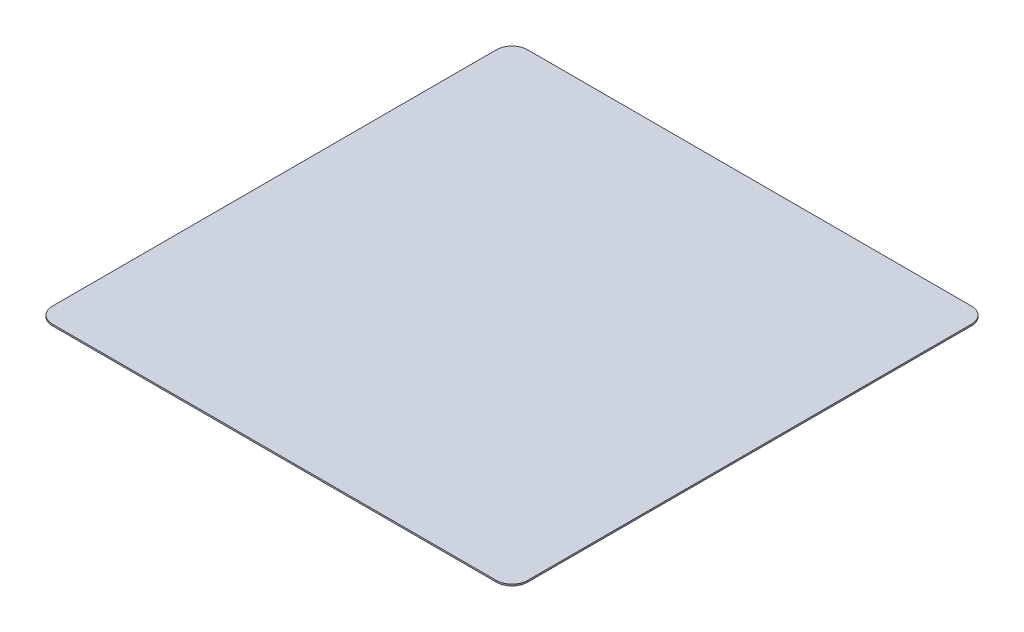
ISO-10303-21;
HEADER;
FILE_DESCRIPTION(('STEP AP214'),'2;1');
FILE_NAME('part.step','',(''),(''),'','','');
FILE_SCHEMA(('AUTOMOTIVE_DESIGN { 1 0 10303 214 1 1 1 1 }'));
ENDSEC;
DATA;
#1=APPLICATION_CONTEXT('core data for automotive mechanical design processes');
#2=APPLICATION_PROTOCOL_DEFINITION('international standard','automotive_design',2000,#1);
#3=PRODUCT_CONTEXT('',#1,'mechanical');
#4=PRODUCT('Part','Part','',(#3));
#5=PRODUCT_RELATED_PRODUCT_CATEGORY('part','',(#4));
#6=PRODUCT_DEFINITION_FORMATION('','',#4);
#7=PRODUCT_DEFINITION_CONTEXT('part definition',#1,'design');
#8=PRODUCT_DEFINITION('design','',#6,#7);
#9=PRODUCT_DEFINITION_SHAPE('','',#8);
#10=(LENGTH_UNIT() NAMED_UNIT(*) SI_UNIT(.MILLI.,.METRE.));
#11=(NAMED_UNIT(*) PLANE_ANGLE_UNIT() SI_UNIT($,.RADIAN.));
#12=(NAMED_UNIT(*) SI_UNIT($,.STERADIAN.) SOLID_ANGLE_UNIT());
#13=UNCERTAINTY_MEASURE_WITH_UNIT(LENGTH_MEASURE(1.E-05),#10,'distance_accuracy_value','');
#14=(GEOMETRIC_REPRESENTATION_CONTEXT(3) GLOBAL_UNCERTAINTY_ASSIGNED_CONTEXT((#13)) GLOBAL_UNIT_ASSIGNED_CONTEXT((#10,
#11,#12)) REPRESENTATION_CONTEXT('',''));
#15=CARTESIAN_POINT('',(0.,0.,0.));
#16=DIRECTION('',(0.,0.,1.));
#17=DIRECTION('',(1.,0.,0.));
#18=AXIS2_PLACEMENT_3D('',#15,#16,#17);
#19=CARTESIAN_POINT('',(0.,1.,0.));
#20=DIRECTION('',(1.,0.,0.));
#21=DIRECTION('',(0.,0.,-1.));
#22=AXIS2_PLACEMENT_3D('',#19,#20,#21);
#23=PLANE('',#22);
#24=DIRECTION('',(0.,0.,1.));
#25=VECTOR('',#24,1.);
#26=CARTESIAN_POINT('',(0.,1.,0.));
#27=LINE('',#26,#25);
#28=CARTESIAN_POINT('',(0.,1.,-295.));
#29=VERTEX_POINT('',#28);
#30=CARTESIAN_POINT('',(0.,1.,-10.));
#31=VERTEX_POINT('',#30);
#32=EDGE_CURVE('E122',#29,#31,#27,.T.);
#33=ORIENTED_EDGE('',*,*,#32,.F.);
#34=DIRECTION('',(0.,-1.,0.));
#35=VECTOR('',#34,1.);
#36=CARTESIAN_POINT('',(0.,1.,-295.));
#37=LINE('',#36,#35);
#38=CARTESIAN_POINT('',(0.,0.,-295.));
#39=VERTEX_POINT('',#38);
#40=EDGE_CURVE('E107',#29,#39,#37,.T.);
#41=ORIENTED_EDGE('',*,*,#40,.T.);
#42=DIRECTION('',(0.,0.,1.));
#43=VECTOR('',#42,1.);
#44=CARTESIAN_POINT('',(0.,0.,0.));
#45=LINE('',#44,#43);
#46=CARTESIAN_POINT('',(0.,0.,-10.));
#47=VERTEX_POINT('',#46);
#48=EDGE_CURVE('E119',#39,#47,#45,.T.);
#49=ORIENTED_EDGE('',*,*,#48,.T.);
#50=DIRECTION('',(0.,-1.,0.));
#51=VECTOR('',#50,1.);
#52=CARTESIAN_POINT('',(0.,1.,-10.));
#53=LINE('',#52,#51);
#54=EDGE_CURVE('E124',#47,#31,#53,.F.);
#55=ORIENTED_EDGE('',*,*,#54,.T.);
#56=EDGE_LOOP('',(#33,#41,#49,#55));
#57=FACE_BOUND('',#56,.T.);
#58=ADVANCED_FACE('F37',(#57),#23,.F.);
#59=CARTESIAN_POINT('',(0.,1.,0.));
#60=DIRECTION('',(0.,0.,-1.));
#61=DIRECTION('',(-1.,0.,0.));
#62=AXIS2_PLACEMENT_3D('',#59,#60,#61);
#63=PLANE('',#62);
#64=DIRECTION('',(1.,0.,0.));
#65=VECTOR('',#64,1.);
#66=CARTESIAN_POINT('',(0.,0.,0.));
#67=LINE('',#66,#65);
#68=CARTESIAN_POINT('',(10.,0.,0.));
#69=VERTEX_POINT('',#68);
#70=CARTESIAN_POINT('',(295.,0.,0.));
#71=VERTEX_POINT('',#70);
#72=EDGE_CURVE('E128',#69,#71,#67,.T.);
#73=ORIENTED_EDGE('',*,*,#72,.T.);
#74=DIRECTION('',(0.,-1.,0.));
#75=VECTOR('',#74,1.);
#76=CARTESIAN_POINT('',(295.,1.,0.));
#77=LINE('',#76,#75);
#78=CARTESIAN_POINT('',(295.,1.,0.));
#79=VERTEX_POINT('',#78);
#80=EDGE_CURVE('E11',#71,#79,#77,.F.);
#81=ORIENTED_EDGE('',*,*,#80,.T.);
#82=DIRECTION('',(1.,0.,0.));
#83=VECTOR('',#82,1.);
#84=CARTESIAN_POINT('',(0.,1.,0.));
#85=LINE('',#84,#83);
#86=CARTESIAN_POINT('',(10.,1.,0.));
#87=VERTEX_POINT('',#86);
#88=EDGE_CURVE('E164',#87,#79,#85,.T.);
#89=ORIENTED_EDGE('',*,*,#88,.F.);
#90=DIRECTION('',(0.,-1.,0.));
#91=VECTOR('',#90,1.);
#92=CARTESIAN_POINT('',(10.,1.,0.));
#93=LINE('',#92,#91);
#94=EDGE_CURVE('E45',#87,#69,#93,.T.);
#95=ORIENTED_EDGE('',*,*,#94,.T.);
#96=EDGE_LOOP('',(#73,#81,#89,#95));
#97=FACE_BOUND('',#96,.T.);
#98=ADVANCED_FACE('F162',(#97),#63,.F.);
#99=CARTESIAN_POINT('',(305.,1.,0.));
#100=DIRECTION('',(-1.,0.,0.));
#101=DIRECTION('',(0.,0.,1.));
#102=AXIS2_PLACEMENT_3D('',#99,#100,#101);
#103=PLANE('',#102);
#104=DIRECTION('',(0.,0.,-1.));
#105=VECTOR('',#104,1.);
#106=CARTESIAN_POINT('',(305.,0.,0.));
#107=LINE('',#106,#105);
#108=CARTESIAN_POINT('',(305.,0.,-10.));
#109=VERTEX_POINT('',#108);
#110=CARTESIAN_POINT('',(305.,0.,-295.));
#111=VERTEX_POINT('',#110);
#112=EDGE_CURVE('E131',#109,#111,#107,.T.);
#113=ORIENTED_EDGE('',*,*,#112,.T.);
#114=DIRECTION('',(0.,-1.,0.));
#115=VECTOR('',#114,1.);
#116=CARTESIAN_POINT('',(305.,1.,-295.));
#117=LINE('',#116,#115);
#118=CARTESIAN_POINT('',(305.,1.,-295.));
#119=VERTEX_POINT('',#118);
#120=EDGE_CURVE('E52',#111,#119,#117,.F.);
#121=ORIENTED_EDGE('',*,*,#120,.T.);
#122=DIRECTION('',(0.,0.,-1.));
#123=VECTOR('',#122,1.);
#124=CARTESIAN_POINT('',(305.,1.,0.));
#125=LINE('',#124,#123);
#126=CARTESIAN_POINT('',(305.,1.,-10.));
#127=VERTEX_POINT('',#126);
#128=EDGE_CURVE('E172',#127,#119,#125,.T.);
#129=ORIENTED_EDGE('',*,*,#128,.F.);
#130=DIRECTION('',(0.,-1.,0.));
#131=VECTOR('',#130,1.);
#132=CARTESIAN_POINT('',(305.,1.,-10.));
#133=LINE('',#132,#131);
#134=EDGE_CURVE('E155',#127,#109,#133,.T.);
#135=ORIENTED_EDGE('',*,*,#134,.T.);
#136=EDGE_LOOP('',(#113,#121,#129,#135));
#137=FACE_BOUND('',#136,.T.);
#138=ADVANCED_FACE('F171',(#137),#103,.F.);
#139=CARTESIAN_POINT('',(0.,1.,-305.));
#140=DIRECTION('',(0.,0.,1.));
#141=DIRECTION('',(1.,0.,0.));
#142=AXIS2_PLACEMENT_3D('',#139,#140,#141);
#143=PLANE('',#142);
#144=DIRECTION('',(-1.,0.,0.));
#145=VECTOR('',#144,1.);
#146=CARTESIAN_POINT('',(0.,0.,-305.));
#147=LINE('',#146,#145);
#148=CARTESIAN_POINT('',(295.,0.,-305.));
#149=VERTEX_POINT('',#148);
#150=CARTESIAN_POINT('',(10.,0.,-305.));
#151=VERTEX_POINT('',#150);
#152=EDGE_CURVE('E138',#149,#151,#147,.T.);
#153=ORIENTED_EDGE('',*,*,#152,.T.);
#154=DIRECTION('',(0.,-1.,0.));
#155=VECTOR('',#154,1.);
#156=CARTESIAN_POINT('',(10.,1.,-305.));
#157=LINE('',#156,#155);
#158=CARTESIAN_POINT('',(10.,1.,-305.));
#159=VERTEX_POINT('',#158);
#160=EDGE_CURVE('E108',#151,#159,#157,.F.);
#161=ORIENTED_EDGE('',*,*,#160,.T.);
#162=DIRECTION('',(-1.,0.,0.));
#163=VECTOR('',#162,1.);
#164=CARTESIAN_POINT('',(0.,1.,-305.));
#165=LINE('',#164,#163);
#166=CARTESIAN_POINT('',(295.,1.,-305.));
#167=VERTEX_POINT('',#166);
#168=EDGE_CURVE('E134',#167,#159,#165,.T.);
#169=ORIENTED_EDGE('',*,*,#168,.F.);
#170=DIRECTION('',(0.,-1.,0.));
#171=VECTOR('',#170,1.);
#172=CARTESIAN_POINT('',(295.,1.,-305.));
#173=LINE('',#172,#171);
#174=EDGE_CURVE('E113',#167,#149,#173,.T.);
#175=ORIENTED_EDGE('',*,*,#174,.T.);
#176=EDGE_LOOP('',(#153,#161,#169,#175));
#177=FACE_BOUND('',#176,.T.);
#178=ADVANCED_FACE('F200',(#177),#143,.F.);
#179=CARTESIAN_POINT('',(0.,1.,0.));
#180=DIRECTION('',(0.,-1.,0.));
#181=DIRECTION('',(0.,0.,-1.));
#182=AXIS2_PLACEMENT_3D('',#179,#180,#181);
#183=PLANE('',#182);
#184=ORIENTED_EDGE('',*,*,#168,.T.);
#185=CARTESIAN_POINT('',(10.,1.,-295.));
#186=DIRECTION('',(0.,-1.,0.));
#187=DIRECTION('',(0.,0.,-1.));
#188=AXIS2_PLACEMENT_3D('',#185,#186,#187);
#189=CIRCLE('',#188,10.);
#190=EDGE_CURVE('E153',#159,#29,#189,.F.);
#191=ORIENTED_EDGE('',*,*,#190,.T.);
#192=ORIENTED_EDGE('',*,*,#32,.T.);
#193=CARTESIAN_POINT('',(10.,1.,-10.));
#194=DIRECTION('',(0.,-1.,0.));
#195=DIRECTION('',(0.,0.,-1.));
#196=AXIS2_PLACEMENT_3D('',#193,#194,#195);
#197=CIRCLE('',#196,10.);
#198=EDGE_CURVE('E148',#31,#87,#197,.F.);
#199=ORIENTED_EDGE('',*,*,#198,.T.);
#200=ORIENTED_EDGE('',*,*,#88,.T.);
#201=CARTESIAN_POINT('',(295.,1.,-10.));
#202=DIRECTION('',(0.,-1.,0.));
#203=DIRECTION('',(0.,0.,-1.));
#204=AXIS2_PLACEMENT_3D('',#201,#202,#203);
#205=CIRCLE('',#204,10.);
#206=EDGE_CURVE('E59',#79,#127,#205,.F.);
#207=ORIENTED_EDGE('',*,*,#206,.T.);
#208=ORIENTED_EDGE('',*,*,#128,.T.);
#209=CARTESIAN_POINT('',(295.,1.,-295.));
#210=DIRECTION('',(0.,-1.,0.));
#211=DIRECTION('',(0.,0.,-1.));
#212=AXIS2_PLACEMENT_3D('',#209,#210,#211);
#213=CIRCLE('',#212,10.);
#214=EDGE_CURVE('E151',#119,#167,#213,.F.);
#215=ORIENTED_EDGE('',*,*,#214,.T.);
#216=EDGE_LOOP('',(#184,#191,#192,#199,#200,#207,#208,#215));
#217=FACE_BOUND('',#216,.T.);
#218=ADVANCED_FACE('F177',(#217),#183,.F.);
#219=CARTESIAN_POINT('',(0.,0.,0.));
#220=DIRECTION('',(0.,-1.,0.));
#221=DIRECTION('',(0.,0.,-1.));
#222=AXIS2_PLACEMENT_3D('',#219,#220,#221);
#223=PLANE('',#222);
#224=ORIENTED_EDGE('',*,*,#48,.F.);
#225=CARTESIAN_POINT('',(10.,0.,-295.));
#226=DIRECTION('',(0.,-1.,0.));
#227=DIRECTION('',(0.,0.,-1.));
#228=AXIS2_PLACEMENT_3D('',#225,#226,#227);
#229=CIRCLE('',#228,10.);
#230=EDGE_CURVE('E103',#39,#151,#229,.T.);
#231=ORIENTED_EDGE('',*,*,#230,.T.);
#232=ORIENTED_EDGE('',*,*,#152,.F.);
#233=CARTESIAN_POINT('',(295.,0.,-295.));
#234=DIRECTION('',(0.,-1.,0.));
#235=DIRECTION('',(0.,0.,-1.));
#236=AXIS2_PLACEMENT_3D('',#233,#234,#235);
#237=CIRCLE('',#236,10.);
#238=EDGE_CURVE('E114',#149,#111,#237,.T.);
#239=ORIENTED_EDGE('',*,*,#238,.T.);
#240=ORIENTED_EDGE('',*,*,#112,.F.);
#241=CARTESIAN_POINT('',(295.,0.,-10.));
#242=DIRECTION('',(0.,-1.,0.));
#243=DIRECTION('',(0.,0.,-1.));
#244=AXIS2_PLACEMENT_3D('',#241,#242,#243);
#245=CIRCLE('',#244,10.);
#246=EDGE_CURVE('E142',#109,#71,#245,.T.);
#247=ORIENTED_EDGE('',*,*,#246,.T.);
#248=ORIENTED_EDGE('',*,*,#72,.F.);
#249=CARTESIAN_POINT('',(10.,0.,-10.));
#250=DIRECTION('',(0.,-1.,0.));
#251=DIRECTION('',(0.,0.,-1.));
#252=AXIS2_PLACEMENT_3D('',#249,#250,#251);
#253=CIRCLE('',#252,10.);
#254=EDGE_CURVE('E123',#69,#47,#253,.T.);
#255=ORIENTED_EDGE('',*,*,#254,.T.);
#256=EDGE_LOOP('',(#224,#231,#232,#239,#240,#247,#248,#255));
#257=FACE_BOUND('',#256,.T.);
#258=ADVANCED_FACE('F126',(#257),#223,.T.);
#259=CARTESIAN_POINT('',(10.,1.,-295.));
#260=DIRECTION('',(0.,-1.,0.));
#261=DIRECTION('',(0.,0.,-1.));
#262=AXIS2_PLACEMENT_3D('',#259,#260,#261);
#263=CYLINDRICAL_SURFACE('',#262,10.);
#264=ORIENTED_EDGE('',*,*,#190,.F.);
#265=ORIENTED_EDGE('',*,*,#160,.F.);
#266=ORIENTED_EDGE('',*,*,#230,.F.);
#267=ORIENTED_EDGE('',*,*,#40,.F.);
#268=EDGE_LOOP('',(#264,#265,#266,#267));
#269=FACE_BOUND('',#268,.T.);
#270=ADVANCED_FACE('F106',(#269),#263,.T.);
#271=CARTESIAN_POINT('',(295.,1.,-295.));
#272=DIRECTION('',(0.,-1.,0.));
#273=DIRECTION('',(0.,0.,-1.));
#274=AXIS2_PLACEMENT_3D('',#271,#272,#273);
#275=CYLINDRICAL_SURFACE('',#274,10.);
#276=ORIENTED_EDGE('',*,*,#214,.F.);
#277=ORIENTED_EDGE('',*,*,#120,.F.);
#278=ORIENTED_EDGE('',*,*,#238,.F.);
#279=ORIENTED_EDGE('',*,*,#174,.F.);
#280=EDGE_LOOP('',(#276,#277,#278,#279));
#281=FACE_BOUND('',#280,.T.);
#282=ADVANCED_FACE('F182',(#281),#275,.T.);
#283=CARTESIAN_POINT('',(295.,1.,-10.));
#284=DIRECTION('',(0.,-1.,0.));
#285=DIRECTION('',(0.,0.,-1.));
#286=AXIS2_PLACEMENT_3D('',#283,#284,#285);
#287=CYLINDRICAL_SURFACE('',#286,10.);
#288=ORIENTED_EDGE('',*,*,#206,.F.);
#289=ORIENTED_EDGE('',*,*,#80,.F.);
#290=ORIENTED_EDGE('',*,*,#246,.F.);
#291=ORIENTED_EDGE('',*,*,#134,.F.);
#292=EDGE_LOOP('',(#288,#289,#290,#291));
#293=FACE_BOUND('',#292,.T.);
#294=ADVANCED_FACE('F170',(#293),#287,.T.);
#295=CARTESIAN_POINT('',(10.,1.,-10.));
#296=DIRECTION('',(0.,-1.,0.));
#297=DIRECTION('',(0.,0.,-1.));
#298=AXIS2_PLACEMENT_3D('',#295,#296,#297);
#299=CYLINDRICAL_SURFACE('',#298,10.);
#300=ORIENTED_EDGE('',*,*,#198,.F.);
#301=ORIENTED_EDGE('',*,*,#54,.F.);
#302=ORIENTED_EDGE('',*,*,#254,.F.);
#303=ORIENTED_EDGE('',*,*,#94,.F.);
#304=EDGE_LOOP('',(#300,#301,#302,#303));
#305=FACE_BOUND('',#304,.T.);
#306=ADVANCED_FACE('F39',(#305),#299,.T.);
#307=CLOSED_SHELL('',(#58,#98,#138,#178,#218,#258,#270,#282,#294,#306));
#308=MANIFOLD_SOLID_BREP('B2',#307);
#309=ADVANCED_BREP_SHAPE_REPRESENTATION('',(#18,#308),#14);
#310=SHAPE_DEFINITION_REPRESENTATION(#9,#309);
ENDSEC;
END-ISO-10303-21;
